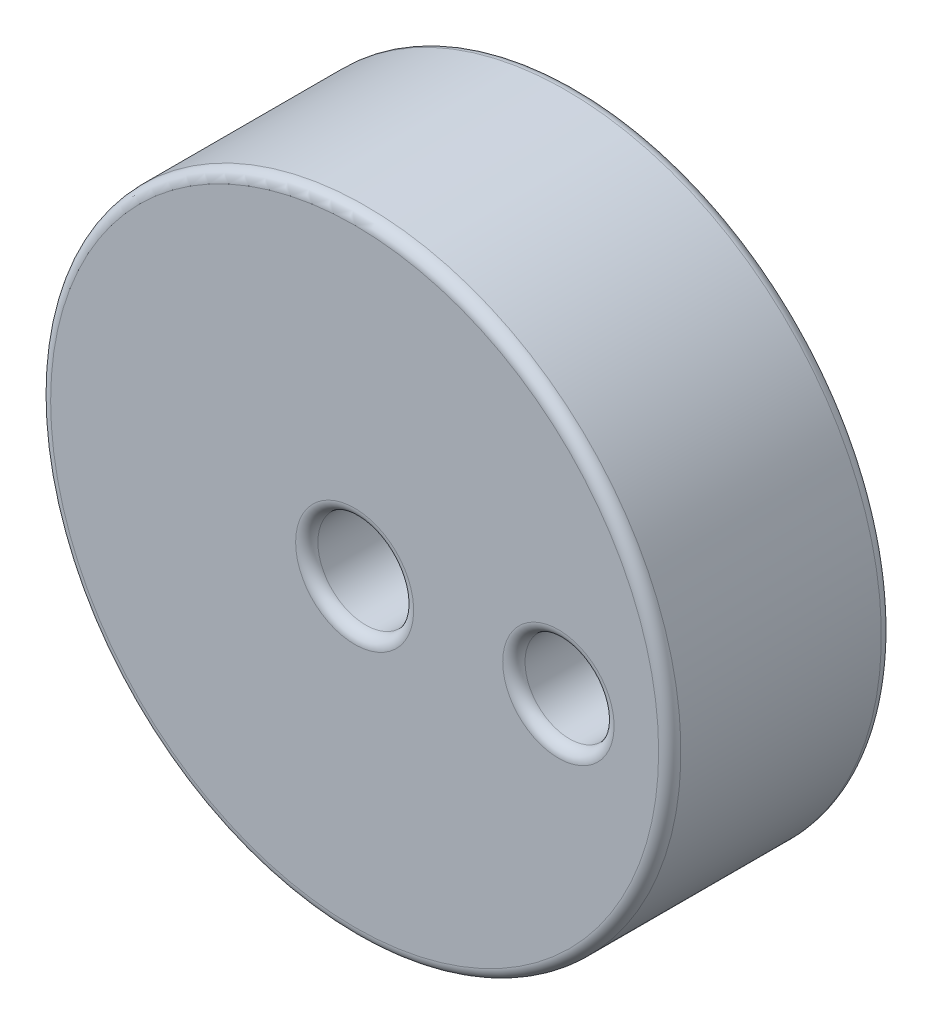
ISO-10303-21;
HEADER;
FILE_DESCRIPTION(('STEP AP214'),'2;1');
FILE_NAME('part.step','',(''),(''),'','','');
FILE_SCHEMA(('AUTOMOTIVE_DESIGN { 1 0 10303 214 1 1 1 1 }'));
ENDSEC;
DATA;
#1=APPLICATION_CONTEXT('core data for automotive mechanical design processes');
#2=APPLICATION_PROTOCOL_DEFINITION('international standard','automotive_design',2000,#1);
#3=PRODUCT_CONTEXT('',#1,'mechanical');
#4=PRODUCT('Part','Part','',(#3));
#5=PRODUCT_RELATED_PRODUCT_CATEGORY('part','',(#4));
#6=PRODUCT_DEFINITION_FORMATION('','',#4);
#7=PRODUCT_DEFINITION_CONTEXT('part definition',#1,'design');
#8=PRODUCT_DEFINITION('design','',#6,#7);
#9=PRODUCT_DEFINITION_SHAPE('','',#8);
#10=(LENGTH_UNIT() NAMED_UNIT(*) SI_UNIT(.MILLI.,.METRE.));
#11=(NAMED_UNIT(*) PLANE_ANGLE_UNIT() SI_UNIT($,.RADIAN.));
#12=(NAMED_UNIT(*) SI_UNIT($,.STERADIAN.) SOLID_ANGLE_UNIT());
#13=UNCERTAINTY_MEASURE_WITH_UNIT(LENGTH_MEASURE(1.E-05),#10,'distance_accuracy_value','');
#14=(GEOMETRIC_REPRESENTATION_CONTEXT(3) GLOBAL_UNCERTAINTY_ASSIGNED_CONTEXT((#13)) GLOBAL_UNIT_ASSIGNED_CONTEXT((#10,
#11,#12)) REPRESENTATION_CONTEXT('',''));
#15=CARTESIAN_POINT('',(0.,0.,0.));
#16=DIRECTION('',(0.,0.,1.));
#17=DIRECTION('',(1.,0.,0.));
#18=AXIS2_PLACEMENT_3D('',#15,#16,#17);
#19=CARTESIAN_POINT('',(0.,0.,0.));
#20=DIRECTION('',(0.,0.,1.));
#21=DIRECTION('',(1.,0.,0.));
#22=AXIS2_PLACEMENT_3D('',#19,#20,#21);
#23=CYLINDRICAL_SURFACE('',#22,2.15);
#24=CARTESIAN_POINT('',(0.,0.,4.));
#25=DIRECTION('',(0.,0.,-1.));
#26=DIRECTION('',(-1.,0.,0.));
#27=AXIS2_PLACEMENT_3D('',#24,#25,#26);
#28=CIRCLE('',#27,2.15);
#29=CARTESIAN_POINT('',(-2.15,0.,4.));
#30=VERTEX_POINT('',#29);
#31=EDGE_CURVE('E62',#30,#30,#28,.F.);
#32=ORIENTED_EDGE('',*,*,#31,.T.);
#33=EDGE_LOOP('',(#32));
#34=FACE_BOUND('',#33,.T.);
#35=CARTESIAN_POINT('',(0.,0.,-1.));
#36=DIRECTION('',(0.,0.,-1.));
#37=DIRECTION('',(-1.,0.,0.));
#38=AXIS2_PLACEMENT_3D('',#35,#36,#37);
#39=CIRCLE('',#38,2.15);
#40=CARTESIAN_POINT('',(-2.15,0.,-1.));
#41=VERTEX_POINT('',#40);
#42=EDGE_CURVE('E65',#41,#41,#39,.T.);
#43=ORIENTED_EDGE('',*,*,#42,.T.);
#44=EDGE_LOOP('',(#43));
#45=FACE_BOUND('',#44,.T.);
#46=ADVANCED_FACE('F33',(#34,#45),#23,.F.);
#47=CARTESIAN_POINT('',(0.,0.,4.5));
#48=DIRECTION('',(0.,0.,-1.));
#49=DIRECTION('',(-1.,0.,0.));
#50=AXIS2_PLACEMENT_3D('',#47,#48,#49);
#51=PLANE('',#50);
#52=CARTESIAN_POINT('',(0.,0.,4.5));
#53=DIRECTION('',(0.,0.,-1.));
#54=DIRECTION('',(-1.,0.,0.));
#55=AXIS2_PLACEMENT_3D('',#52,#53,#54);
#56=CIRCLE('',#55,13.65);
#57=CARTESIAN_POINT('',(-13.65,0.,4.5));
#58=VERTEX_POINT('',#57);
#59=EDGE_CURVE('E74',#58,#58,#56,.F.);
#60=ORIENTED_EDGE('',*,*,#59,.T.);
#61=EDGE_LOOP('',(#60));
#62=FACE_BOUND('',#61,.T.);
#63=CARTESIAN_POINT('',(0.,0.,4.5));
#64=DIRECTION('',(0.,0.,-1.));
#65=DIRECTION('',(-1.,0.,0.));
#66=AXIS2_PLACEMENT_3D('',#63,#64,#65);
#67=CIRCLE('',#66,2.65);
#68=CARTESIAN_POINT('',(-2.65,0.,4.5));
#69=VERTEX_POINT('',#68);
#70=EDGE_CURVE('E77',#69,#69,#67,.T.);
#71=ORIENTED_EDGE('',*,*,#70,.T.);
#72=EDGE_LOOP('',(#71));
#73=FACE_BOUND('',#72,.T.);
#74=CARTESIAN_POINT('',(9.15,0.,4.5));
#75=DIRECTION('',(0.,0.,-1.));
#76=DIRECTION('',(-1.,0.,0.));
#77=AXIS2_PLACEMENT_3D('',#74,#75,#76);
#78=CIRCLE('',#77,2.5);
#79=CARTESIAN_POINT('',(6.65,0.,4.5));
#80=VERTEX_POINT('',#79);
#81=EDGE_CURVE('E80',#80,#80,#78,.T.);
#82=ORIENTED_EDGE('',*,*,#81,.T.);
#83=EDGE_LOOP('',(#82));
#84=FACE_BOUND('',#83,.T.);
#85=ADVANCED_FACE('F103',(#62,#73,#84),#51,.F.);
#86=CARTESIAN_POINT('',(0.,0.,0.));
#87=DIRECTION('',(0.,0.,1.));
#88=DIRECTION('',(1.,0.,0.));
#89=AXIS2_PLACEMENT_3D('',#86,#87,#88);
#90=CYLINDRICAL_SURFACE('',#89,14.15);
#91=CARTESIAN_POINT('',(0.,0.,4.));
#92=DIRECTION('',(0.,0.,-1.));
#93=DIRECTION('',(-1.,0.,0.));
#94=AXIS2_PLACEMENT_3D('',#91,#92,#93);
#95=CIRCLE('',#94,14.15);
#96=CARTESIAN_POINT('',(-14.15,0.,4.));
#97=VERTEX_POINT('',#96);
#98=EDGE_CURVE('E68',#97,#97,#95,.T.);
#99=ORIENTED_EDGE('',*,*,#98,.T.);
#100=EDGE_LOOP('',(#99));
#101=FACE_BOUND('',#100,.T.);
#102=CARTESIAN_POINT('',(0.,0.,-5.));
#103=DIRECTION('',(0.,0.,-1.));
#104=DIRECTION('',(-1.,0.,0.));
#105=AXIS2_PLACEMENT_3D('',#102,#103,#104);
#106=CIRCLE('',#105,14.15);
#107=CARTESIAN_POINT('',(-14.15,0.,-5.));
#108=VERTEX_POINT('',#107);
#109=EDGE_CURVE('E71',#108,#108,#106,.F.);
#110=ORIENTED_EDGE('',*,*,#109,.T.);
#111=EDGE_LOOP('',(#110));
#112=FACE_BOUND('',#111,.T.);
#113=ADVANCED_FACE('F109',(#101,#112),#90,.T.);
#114=CARTESIAN_POINT('',(0.,0.,-5.5));
#115=DIRECTION('',(0.,0.,-1.));
#116=DIRECTION('',(-1.,0.,0.));
#117=AXIS2_PLACEMENT_3D('',#114,#115,#116);
#118=PLANE('',#117);
#119=CARTESIAN_POINT('',(0.,0.,-5.5));
#120=DIRECTION('',(0.,0.,-1.));
#121=DIRECTION('',(-1.,0.,0.));
#122=AXIS2_PLACEMENT_3D('',#119,#120,#121);
#123=CIRCLE('',#122,13.65);
#124=CARTESIAN_POINT('',(-13.65,0.,-5.5));
#125=VERTEX_POINT('',#124);
#126=EDGE_CURVE('E44',#125,#125,#123,.T.);
#127=ORIENTED_EDGE('',*,*,#126,.T.);
#128=EDGE_LOOP('',(#127));
#129=FACE_BOUND('',#128,.T.);
#130=CARTESIAN_POINT('',(0.,0.,-5.5));
#131=DIRECTION('',(0.,0.,-1.));
#132=DIRECTION('',(-1.,0.,0.));
#133=AXIS2_PLACEMENT_3D('',#130,#131,#132);
#134=CIRCLE('',#133,4.1);
#135=CARTESIAN_POINT('',(-4.1,0.,-5.5));
#136=VERTEX_POINT('',#135);
#137=EDGE_CURVE('E48',#136,#136,#134,.F.);
#138=ORIENTED_EDGE('',*,*,#137,.T.);
#139=EDGE_LOOP('',(#138));
#140=FACE_BOUND('',#139,.T.);
#141=CARTESIAN_POINT('',(9.15,0.,-5.5));
#142=DIRECTION('',(0.,0.,-1.));
#143=DIRECTION('',(-1.,0.,0.));
#144=AXIS2_PLACEMENT_3D('',#141,#142,#143);
#145=CIRCLE('',#144,2.5);
#146=CARTESIAN_POINT('',(6.65,0.,-5.5));
#147=VERTEX_POINT('',#146);
#148=EDGE_CURVE('E53',#147,#147,#145,.F.);
#149=ORIENTED_EDGE('',*,*,#148,.T.);
#150=EDGE_LOOP('',(#149));
#151=FACE_BOUND('',#150,.T.);
#152=ADVANCED_FACE('F100',(#129,#140,#151),#118,.T.);
#153=CARTESIAN_POINT('',(0.,0.,0.));
#154=DIRECTION('',(0.,0.,1.));
#155=DIRECTION('',(1.,0.,0.));
#156=AXIS2_PLACEMENT_3D('',#153,#154,#155);
#157=CYLINDRICAL_SURFACE('',#156,3.6);
#158=CARTESIAN_POINT('',(0.,0.,-5.));
#159=DIRECTION('',(0.,0.,-1.));
#160=DIRECTION('',(-1.,0.,0.));
#161=AXIS2_PLACEMENT_3D('',#158,#159,#160);
#162=CIRCLE('',#161,3.6);
#163=CARTESIAN_POINT('',(-3.6,0.,-5.));
#164=VERTEX_POINT('',#163);
#165=EDGE_CURVE('E40',#164,#164,#162,.T.);
#166=ORIENTED_EDGE('',*,*,#165,.T.);
#167=EDGE_LOOP('',(#166));
#168=FACE_BOUND('',#167,.T.);
#169=CARTESIAN_POINT('',(0.,0.,-1.5));
#170=DIRECTION('',(0.,0.,1.));
#171=DIRECTION('',(1.,0.,0.));
#172=AXIS2_PLACEMENT_3D('',#169,#170,#171);
#173=CIRCLE('',#172,3.6);
#174=CARTESIAN_POINT('',(3.6,0.,-1.5));
#175=VERTEX_POINT('',#174);
#176=EDGE_CURVE('E83',#175,#175,#173,.T.);
#177=ORIENTED_EDGE('',*,*,#176,.T.);
#178=EDGE_LOOP('',(#177));
#179=FACE_BOUND('',#178,.T.);
#180=ADVANCED_FACE('F87',(#168,#179),#157,.F.);
#181=CARTESIAN_POINT('',(0.,0.,-1.5));
#182=DIRECTION('',(0.,0.,-1.));
#183=DIRECTION('',(-1.,0.,0.));
#184=AXIS2_PLACEMENT_3D('',#181,#182,#183);
#185=PLANE('',#184);
#186=CARTESIAN_POINT('',(0.,0.,-1.5));
#187=DIRECTION('',(0.,0.,-1.));
#188=DIRECTION('',(-1.,0.,0.));
#189=AXIS2_PLACEMENT_3D('',#186,#187,#188);
#190=CIRCLE('',#189,2.65);
#191=CARTESIAN_POINT('',(-2.65,0.,-1.5));
#192=VERTEX_POINT('',#191);
#193=EDGE_CURVE('E10',#192,#192,#190,.F.);
#194=ORIENTED_EDGE('',*,*,#193,.T.);
#195=EDGE_LOOP('',(#194));
#196=FACE_BOUND('',#195,.T.);
#197=ORIENTED_EDGE('',*,*,#176,.F.);
#198=EDGE_LOOP('',(#197));
#199=FACE_BOUND('',#198,.T.);
#200=ADVANCED_FACE('F89',(#196,#199),#185,.T.);
#201=CARTESIAN_POINT('',(9.15,0.,4.5));
#202=DIRECTION('',(0.,0.,-1.));
#203=DIRECTION('',(-1.,0.,0.));
#204=AXIS2_PLACEMENT_3D('',#201,#202,#203);
#205=CYLINDRICAL_SURFACE('',#204,2.);
#206=CARTESIAN_POINT('',(9.15,0.,4.));
#207=DIRECTION('',(0.,0.,-1.));
#208=DIRECTION('',(-1.,0.,0.));
#209=AXIS2_PLACEMENT_3D('',#206,#207,#208);
#210=CIRCLE('',#209,2.);
#211=CARTESIAN_POINT('',(7.15,0.,4.));
#212=VERTEX_POINT('',#211);
#213=EDGE_CURVE('E56',#212,#212,#210,.F.);
#214=ORIENTED_EDGE('',*,*,#213,.T.);
#215=EDGE_LOOP('',(#214));
#216=FACE_BOUND('',#215,.T.);
#217=CARTESIAN_POINT('',(9.15,0.,-5.));
#218=DIRECTION('',(0.,0.,-1.));
#219=DIRECTION('',(-1.,0.,0.));
#220=AXIS2_PLACEMENT_3D('',#217,#218,#219);
#221=CIRCLE('',#220,2.);
#222=CARTESIAN_POINT('',(7.15,0.,-5.));
#223=VERTEX_POINT('',#222);
#224=EDGE_CURVE('E59',#223,#223,#221,.T.);
#225=ORIENTED_EDGE('',*,*,#224,.T.);
#226=EDGE_LOOP('',(#225));
#227=FACE_BOUND('',#226,.T.);
#228=ADVANCED_FACE('F91',(#216,#227),#205,.F.);
#229=CARTESIAN_POINT('',(0.,0.,4.));
#230=DIRECTION('',(0.,0.,-1.));
#231=DIRECTION('',(-1.,0.,0.));
#232=AXIS2_PLACEMENT_3D('',#229,#230,#231);
#233=TOROIDAL_SURFACE('',#232,13.65,0.5);
#234=ORIENTED_EDGE('',*,*,#98,.F.);
#235=EDGE_LOOP('',(#234));
#236=FACE_BOUND('',#235,.T.);
#237=ORIENTED_EDGE('',*,*,#59,.F.);
#238=EDGE_LOOP('',(#237));
#239=FACE_BOUND('',#238,.T.);
#240=ADVANCED_FACE('F97',(#236,#239),#233,.T.);
#241=CARTESIAN_POINT('',(0.,0.,4.));
#242=DIRECTION('',(0.,0.,-1.));
#243=DIRECTION('',(-1.,0.,0.));
#244=AXIS2_PLACEMENT_3D('',#241,#242,#243);
#245=TOROIDAL_SURFACE('',#244,2.65,0.5);
#246=ORIENTED_EDGE('',*,*,#70,.F.);
#247=EDGE_LOOP('',(#246));
#248=FACE_BOUND('',#247,.T.);
#249=ORIENTED_EDGE('',*,*,#31,.F.);
#250=EDGE_LOOP('',(#249));
#251=FACE_BOUND('',#250,.T.);
#252=ADVANCED_FACE('F117',(#248,#251),#245,.T.);
#253=CARTESIAN_POINT('',(9.15,0.,4.));
#254=DIRECTION('',(0.,0.,-1.));
#255=DIRECTION('',(-1.,0.,0.));
#256=AXIS2_PLACEMENT_3D('',#253,#254,#255);
#257=TOROIDAL_SURFACE('',#256,2.5,0.5);
#258=ORIENTED_EDGE('',*,*,#213,.F.);
#259=EDGE_LOOP('',(#258));
#260=FACE_BOUND('',#259,.T.);
#261=ORIENTED_EDGE('',*,*,#81,.F.);
#262=EDGE_LOOP('',(#261));
#263=FACE_BOUND('',#262,.T.);
#264=ADVANCED_FACE('F121',(#260,#263),#257,.T.);
#265=CARTESIAN_POINT('',(0.,0.,-5.));
#266=DIRECTION('',(0.,0.,-1.));
#267=DIRECTION('',(-1.,0.,0.));
#268=AXIS2_PLACEMENT_3D('',#265,#266,#267);
#269=TOROIDAL_SURFACE('',#268,13.65,0.5);
#270=ORIENTED_EDGE('',*,*,#126,.F.);
#271=EDGE_LOOP('',(#270));
#272=FACE_BOUND('',#271,.T.);
#273=ORIENTED_EDGE('',*,*,#109,.F.);
#274=EDGE_LOOP('',(#273));
#275=FACE_BOUND('',#274,.T.);
#276=ADVANCED_FACE('F125',(#272,#275),#269,.T.);
#277=CARTESIAN_POINT('',(0.,0.,-5.));
#278=DIRECTION('',(0.,0.,-1.));
#279=DIRECTION('',(-1.,0.,0.));
#280=AXIS2_PLACEMENT_3D('',#277,#278,#279);
#281=TOROIDAL_SURFACE('',#280,4.1,0.5);
#282=ORIENTED_EDGE('',*,*,#165,.F.);
#283=EDGE_LOOP('',(#282));
#284=FACE_BOUND('',#283,.T.);
#285=ORIENTED_EDGE('',*,*,#137,.F.);
#286=EDGE_LOOP('',(#285));
#287=FACE_BOUND('',#286,.T.);
#288=ADVANCED_FACE('F129',(#284,#287),#281,.T.);
#289=CARTESIAN_POINT('',(9.15,0.,-5.));
#290=DIRECTION('',(0.,0.,-1.));
#291=DIRECTION('',(-1.,0.,0.));
#292=AXIS2_PLACEMENT_3D('',#289,#290,#291);
#293=TOROIDAL_SURFACE('',#292,2.5,0.5);
#294=ORIENTED_EDGE('',*,*,#148,.F.);
#295=EDGE_LOOP('',(#294));
#296=FACE_BOUND('',#295,.T.);
#297=ORIENTED_EDGE('',*,*,#224,.F.);
#298=EDGE_LOOP('',(#297));
#299=FACE_BOUND('',#298,.T.);
#300=ADVANCED_FACE('F132',(#296,#299),#293,.T.);
#301=CARTESIAN_POINT('',(0.,0.,-1.));
#302=DIRECTION('',(0.,0.,-1.));
#303=DIRECTION('',(-1.,0.,0.));
#304=AXIS2_PLACEMENT_3D('',#301,#302,#303);
#305=TOROIDAL_SURFACE('',#304,2.65,0.5);
#306=ORIENTED_EDGE('',*,*,#42,.F.);
#307=EDGE_LOOP('',(#306));
#308=FACE_BOUND('',#307,.T.);
#309=ORIENTED_EDGE('',*,*,#193,.F.);
#310=EDGE_LOOP('',(#309));
#311=FACE_BOUND('',#310,.T.);
#312=ADVANCED_FACE('F35',(#308,#311),#305,.T.);
#313=CLOSED_SHELL('',(#46,#85,#113,#152,#180,#200,#228,#240,#252,#264,#276,#288,#300,#312));
#314=MANIFOLD_SOLID_BREP('B2',#313);
#315=ADVANCED_BREP_SHAPE_REPRESENTATION('',(#18,#314),#14);
#316=SHAPE_DEFINITION_REPRESENTATION(#9,#315);
ENDSEC;
END-ISO-10303-21;
